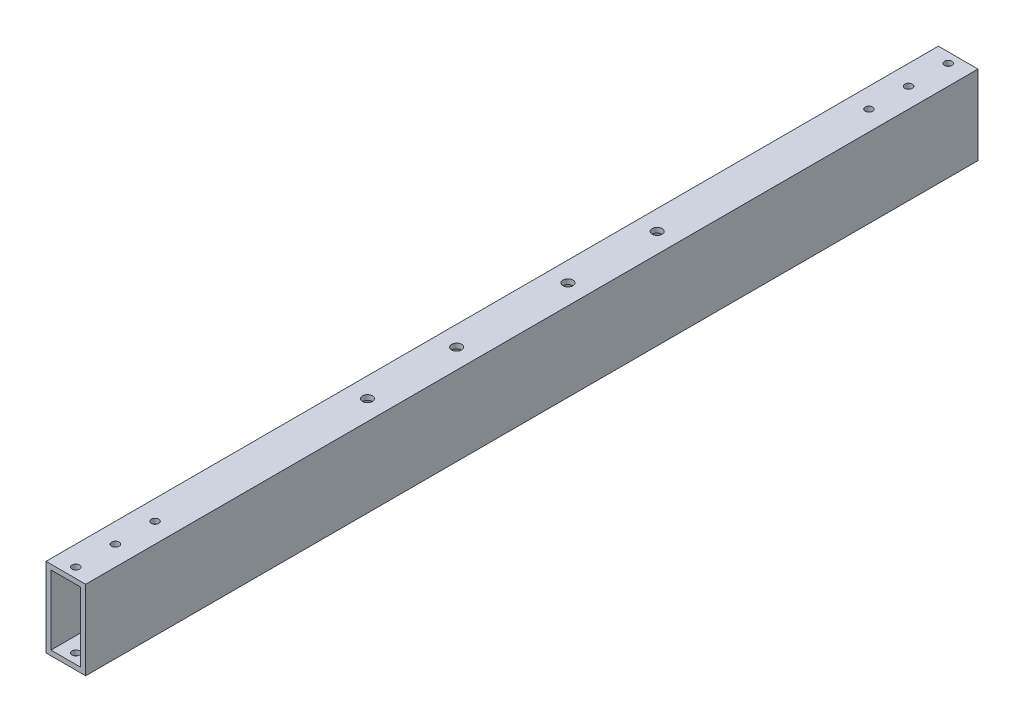
ISO-10303-21;
HEADER;
FILE_DESCRIPTION(('STEP AP214'),'2;1');
FILE_NAME('part.step','',(''),(''),'','','');
FILE_SCHEMA(('AUTOMOTIVE_DESIGN { 1 0 10303 214 1 1 1 1 }'));
ENDSEC;
DATA;
#1=APPLICATION_CONTEXT('core data for automotive mechanical design processes');
#2=APPLICATION_PROTOCOL_DEFINITION('international standard','automotive_design',2000,#1);
#3=PRODUCT_CONTEXT('',#1,'mechanical');
#4=PRODUCT('Part','Part','',(#3));
#5=PRODUCT_RELATED_PRODUCT_CATEGORY('part','',(#4));
#6=PRODUCT_DEFINITION_FORMATION('','',#4);
#7=PRODUCT_DEFINITION_CONTEXT('part definition',#1,'design');
#8=PRODUCT_DEFINITION('design','',#6,#7);
#9=PRODUCT_DEFINITION_SHAPE('','',#8);
#10=(LENGTH_UNIT() NAMED_UNIT(*) SI_UNIT(.MILLI.,.METRE.));
#11=(NAMED_UNIT(*) PLANE_ANGLE_UNIT() SI_UNIT($,.RADIAN.));
#12=(NAMED_UNIT(*) SI_UNIT($,.STERADIAN.) SOLID_ANGLE_UNIT());
#13=UNCERTAINTY_MEASURE_WITH_UNIT(LENGTH_MEASURE(1.E-05),#10,'distance_accuracy_value','');
#14=(GEOMETRIC_REPRESENTATION_CONTEXT(3) GLOBAL_UNCERTAINTY_ASSIGNED_CONTEXT((#13)) GLOBAL_UNIT_ASSIGNED_CONTEXT((#10,
#11,#12)) REPRESENTATION_CONTEXT('',''));
#15=CARTESIAN_POINT('',(0.,0.,0.));
#16=DIRECTION('',(0.,0.,1.));
#17=DIRECTION('',(1.,0.,0.));
#18=AXIS2_PLACEMENT_3D('',#15,#16,#17);
#19=CARTESIAN_POINT('',(0.,0.,571.5));
#20=DIRECTION('',(0.,0.,1.));
#21=DIRECTION('',(1.,0.,0.));
#22=AXIS2_PLACEMENT_3D('',#19,#20,#21);
#23=PLANE('',#22);
#24=DIRECTION('',(0.,1.,0.));
#25=VECTOR('',#24,1.);
#26=CARTESIAN_POINT('',(12.7,-25.4,571.5));
#27=LINE('',#26,#25);
#28=CARTESIAN_POINT('',(12.7,-25.4,571.5));
#29=VERTEX_POINT('',#28);
#30=CARTESIAN_POINT('',(12.7,25.4,571.5));
#31=VERTEX_POINT('',#30);
#32=EDGE_CURVE('E166',#29,#31,#27,.T.);
#33=ORIENTED_EDGE('',*,*,#32,.T.);
#34=DIRECTION('',(-1.,0.,0.));
#35=VECTOR('',#34,1.);
#36=CARTESIAN_POINT('',(-12.7,25.4,571.5));
#37=LINE('',#36,#35);
#38=CARTESIAN_POINT('',(-12.7,25.4,571.5));
#39=VERTEX_POINT('',#38);
#40=EDGE_CURVE('E169',#31,#39,#37,.T.);
#41=ORIENTED_EDGE('',*,*,#40,.T.);
#42=DIRECTION('',(0.,-1.,0.));
#43=VECTOR('',#42,1.);
#44=CARTESIAN_POINT('',(-12.7,-25.4,571.5));
#45=LINE('',#44,#43);
#46=CARTESIAN_POINT('',(-12.7,-25.4,571.5));
#47=VERTEX_POINT('',#46);
#48=EDGE_CURVE('E172',#39,#47,#45,.T.);
#49=ORIENTED_EDGE('',*,*,#48,.T.);
#50=DIRECTION('',(1.,0.,0.));
#51=VECTOR('',#50,1.);
#52=CARTESIAN_POINT('',(-12.7,-25.4,571.5));
#53=LINE('',#52,#51);
#54=EDGE_CURVE('E174',#47,#29,#53,.T.);
#55=ORIENTED_EDGE('',*,*,#54,.T.);
#56=EDGE_LOOP('',(#33,#41,#49,#55));
#57=FACE_BOUND('',#56,.T.);
#58=DIRECTION('',(-1.,0.,0.));
#59=VECTOR('',#58,1.);
#60=CARTESIAN_POINT('',(0.,22.225,571.5));
#61=LINE('',#60,#59);
#62=CARTESIAN_POINT('',(9.525,22.225,571.5));
#63=VERTEX_POINT('',#62);
#64=CARTESIAN_POINT('',(-9.525,22.225,571.5));
#65=VERTEX_POINT('',#64);
#66=EDGE_CURVE('E136',#63,#65,#61,.T.);
#67=ORIENTED_EDGE('',*,*,#66,.F.);
#68=DIRECTION('',(0.,1.,0.));
#69=VECTOR('',#68,1.);
#70=CARTESIAN_POINT('',(9.525,0.,571.5));
#71=LINE('',#70,#69);
#72=CARTESIAN_POINT('',(9.525,-22.225,571.5));
#73=VERTEX_POINT('',#72);
#74=EDGE_CURVE('E128',#73,#63,#71,.T.);
#75=ORIENTED_EDGE('',*,*,#74,.F.);
#76=DIRECTION('',(1.,0.,0.));
#77=VECTOR('',#76,1.);
#78=CARTESIAN_POINT('',(0.,-22.225,571.5));
#79=LINE('',#78,#77);
#80=CARTESIAN_POINT('',(-9.525,-22.225,571.5));
#81=VERTEX_POINT('',#80);
#82=EDGE_CURVE('E150',#81,#73,#79,.T.);
#83=ORIENTED_EDGE('',*,*,#82,.F.);
#84=DIRECTION('',(0.,-1.,0.));
#85=VECTOR('',#84,1.);
#86=CARTESIAN_POINT('',(-9.525,0.,571.5));
#87=LINE('',#86,#85);
#88=EDGE_CURVE('E148',#65,#81,#87,.T.);
#89=ORIENTED_EDGE('',*,*,#88,.F.);
#90=EDGE_LOOP('',(#67,#75,#83,#89));
#91=FACE_BOUND('',#90,.T.);
#92=ADVANCED_FACE('F61',(#57,#91),#23,.T.);
#93=CARTESIAN_POINT('',(0.,0.,0.));
#94=DIRECTION('',(0.,0.,1.));
#95=DIRECTION('',(1.,0.,0.));
#96=AXIS2_PLACEMENT_3D('',#93,#94,#95);
#97=PLANE('',#96);
#98=DIRECTION('',(0.,1.,0.));
#99=VECTOR('',#98,1.);
#100=CARTESIAN_POINT('',(12.7,-25.4,0.));
#101=LINE('',#100,#99);
#102=CARTESIAN_POINT('',(12.7,-25.4,0.));
#103=VERTEX_POINT('',#102);
#104=CARTESIAN_POINT('',(12.7,25.4,0.));
#105=VERTEX_POINT('',#104);
#106=EDGE_CURVE('E144',#103,#105,#101,.T.);
#107=ORIENTED_EDGE('',*,*,#106,.F.);
#108=DIRECTION('',(1.,0.,0.));
#109=VECTOR('',#108,1.);
#110=CARTESIAN_POINT('',(-12.7,-25.4,0.));
#111=LINE('',#110,#109);
#112=CARTESIAN_POINT('',(-12.7,-25.4,0.));
#113=VERTEX_POINT('',#112);
#114=EDGE_CURVE('E170',#113,#103,#111,.T.);
#115=ORIENTED_EDGE('',*,*,#114,.F.);
#116=DIRECTION('',(0.,-1.,0.));
#117=VECTOR('',#116,1.);
#118=CARTESIAN_POINT('',(-12.7,-25.4,0.));
#119=LINE('',#118,#117);
#120=CARTESIAN_POINT('',(-12.7,25.4,0.));
#121=VERTEX_POINT('',#120);
#122=EDGE_CURVE('E181',#121,#113,#119,.T.);
#123=ORIENTED_EDGE('',*,*,#122,.F.);
#124=DIRECTION('',(-1.,0.,0.));
#125=VECTOR('',#124,1.);
#126=CARTESIAN_POINT('',(-12.7,25.4,0.));
#127=LINE('',#126,#125);
#128=EDGE_CURVE('E179',#105,#121,#127,.T.);
#129=ORIENTED_EDGE('',*,*,#128,.F.);
#130=EDGE_LOOP('',(#107,#115,#123,#129));
#131=FACE_BOUND('',#130,.T.);
#132=DIRECTION('',(0.,1.,0.));
#133=VECTOR('',#132,1.);
#134=CARTESIAN_POINT('',(9.525,0.,0.));
#135=LINE('',#134,#133);
#136=CARTESIAN_POINT('',(9.525,-22.225,0.));
#137=VERTEX_POINT('',#136);
#138=CARTESIAN_POINT('',(9.525,22.225,0.));
#139=VERTEX_POINT('',#138);
#140=EDGE_CURVE('E86',#137,#139,#135,.T.);
#141=ORIENTED_EDGE('',*,*,#140,.T.);
#142=DIRECTION('',(-1.,0.,0.));
#143=VECTOR('',#142,1.);
#144=CARTESIAN_POINT('',(0.,22.225,0.));
#145=LINE('',#144,#143);
#146=CARTESIAN_POINT('',(-9.525,22.225,0.));
#147=VERTEX_POINT('',#146);
#148=EDGE_CURVE('E143',#139,#147,#145,.T.);
#149=ORIENTED_EDGE('',*,*,#148,.T.);
#150=DIRECTION('',(0.,-1.,0.));
#151=VECTOR('',#150,1.);
#152=CARTESIAN_POINT('',(-9.525,0.,0.));
#153=LINE('',#152,#151);
#154=CARTESIAN_POINT('',(-9.525,-22.225,0.));
#155=VERTEX_POINT('',#154);
#156=EDGE_CURVE('E158',#147,#155,#153,.T.);
#157=ORIENTED_EDGE('',*,*,#156,.T.);
#158=DIRECTION('',(1.,0.,0.));
#159=VECTOR('',#158,1.);
#160=CARTESIAN_POINT('',(0.,-22.225,0.));
#161=LINE('',#160,#159);
#162=EDGE_CURVE('E137',#155,#137,#161,.T.);
#163=ORIENTED_EDGE('',*,*,#162,.T.);
#164=EDGE_LOOP('',(#141,#149,#157,#163));
#165=FACE_BOUND('',#164,.T.);
#166=ADVANCED_FACE('F365',(#131,#165),#97,.F.);
#167=CARTESIAN_POINT('',(12.7,-25.4,571.5));
#168=DIRECTION('',(-1.,0.,0.));
#169=DIRECTION('',(0.,0.,1.));
#170=AXIS2_PLACEMENT_3D('',#167,#168,#169);
#171=PLANE('',#170);
#172=ORIENTED_EDGE('',*,*,#106,.T.);
#173=DIRECTION('',(0.,0.,-1.));
#174=VECTOR('',#173,1.);
#175=CARTESIAN_POINT('',(12.7,25.4,571.5));
#176=LINE('',#175,#174);
#177=EDGE_CURVE('E12',#31,#105,#176,.T.);
#178=ORIENTED_EDGE('',*,*,#177,.F.);
#179=ORIENTED_EDGE('',*,*,#32,.F.);
#180=DIRECTION('',(0.,0.,-1.));
#181=VECTOR('',#180,1.);
#182=CARTESIAN_POINT('',(12.7,-25.4,571.5));
#183=LINE('',#182,#181);
#184=EDGE_CURVE('E176',#29,#103,#183,.T.);
#185=ORIENTED_EDGE('',*,*,#184,.T.);
#186=EDGE_LOOP('',(#172,#178,#179,#185));
#187=FACE_BOUND('',#186,.T.);
#188=ADVANCED_FACE('F63',(#187),#171,.F.);
#189=CARTESIAN_POINT('',(-12.7,25.4,571.5));
#190=DIRECTION('',(0.,-1.,0.));
#191=DIRECTION('',(0.,0.,-1.));
#192=AXIS2_PLACEMENT_3D('',#189,#190,#191);
#193=PLANE('',#192);
#194=CARTESIAN_POINT('',(0.,25.4,321.183));
#195=DIRECTION('',(0.,1.,0.));
#196=DIRECTION('',(0.,0.,1.));
#197=AXIS2_PLACEMENT_3D('',#194,#195,#196);
#198=CIRCLE('',#197,3.17499999999999);
#199=CARTESIAN_POINT('',(0.,25.4,324.358));
#200=VERTEX_POINT('',#199);
#201=EDGE_CURVE('E243',#200,#200,#198,.T.);
#202=ORIENTED_EDGE('',*,*,#201,.F.);
#203=EDGE_LOOP('',(#202));
#204=FACE_BOUND('',#203,.T.);
#205=CARTESIAN_POINT('',(0.,25.4,378.333));
#206=DIRECTION('',(0.,1.,0.));
#207=DIRECTION('',(0.,0.,1.));
#208=AXIS2_PLACEMENT_3D('',#205,#206,#207);
#209=CIRCLE('',#208,3.17499999999999);
#210=CARTESIAN_POINT('',(0.,25.4,381.508));
#211=VERTEX_POINT('',#210);
#212=EDGE_CURVE('E283',#211,#211,#209,.T.);
#213=ORIENTED_EDGE('',*,*,#212,.F.);
#214=EDGE_LOOP('',(#213));
#215=FACE_BOUND('',#214,.T.);
#216=CARTESIAN_POINT('',(0.,25.4,192.786));
#217=DIRECTION('',(0.,1.,0.));
#218=DIRECTION('',(0.,0.,1.));
#219=AXIS2_PLACEMENT_3D('',#216,#217,#218);
#220=CIRCLE('',#219,3.17499999999999);
#221=CARTESIAN_POINT('',(0.,25.4,195.961));
#222=VERTEX_POINT('',#221);
#223=EDGE_CURVE('E290',#222,#222,#220,.T.);
#224=ORIENTED_EDGE('',*,*,#223,.F.);
#225=EDGE_LOOP('',(#224));
#226=FACE_BOUND('',#225,.T.);
#227=CARTESIAN_POINT('',(0.,25.4,249.936));
#228=DIRECTION('',(0.,1.,0.));
#229=DIRECTION('',(0.,0.,1.));
#230=AXIS2_PLACEMENT_3D('',#227,#228,#229);
#231=CIRCLE('',#230,3.17499999999999);
#232=CARTESIAN_POINT('',(0.,25.4,253.111));
#233=VERTEX_POINT('',#232);
#234=EDGE_CURVE('E297',#233,#233,#231,.T.);
#235=ORIENTED_EDGE('',*,*,#234,.F.);
#236=EDGE_LOOP('',(#235));
#237=FACE_BOUND('',#236,.T.);
#238=CARTESIAN_POINT('',(0.,25.4,6.35));
#239=DIRECTION('',(0.,1.,0.));
#240=DIRECTION('',(0.,0.,1.));
#241=AXIS2_PLACEMENT_3D('',#238,#239,#240);
#242=CIRCLE('',#241,2.38125);
#243=CARTESIAN_POINT('',(0.,25.4,8.73125));
#244=VERTEX_POINT('',#243);
#245=EDGE_CURVE('E304',#244,#244,#242,.T.);
#246=ORIENTED_EDGE('',*,*,#245,.F.);
#247=EDGE_LOOP('',(#246));
#248=FACE_BOUND('',#247,.T.);
#249=CARTESIAN_POINT('',(0.,25.4,31.75));
#250=DIRECTION('',(0.,1.,0.));
#251=DIRECTION('',(0.,0.,1.));
#252=AXIS2_PLACEMENT_3D('',#249,#250,#251);
#253=CIRCLE('',#252,2.38125);
#254=CARTESIAN_POINT('',(0.,25.4,34.13125));
#255=VERTEX_POINT('',#254);
#256=EDGE_CURVE('E311',#255,#255,#253,.T.);
#257=ORIENTED_EDGE('',*,*,#256,.F.);
#258=EDGE_LOOP('',(#257));
#259=FACE_BOUND('',#258,.T.);
#260=CARTESIAN_POINT('',(0.,25.4,57.1499999999999));
#261=DIRECTION('',(0.,1.,0.));
#262=DIRECTION('',(0.,0.,1.));
#263=AXIS2_PLACEMENT_3D('',#260,#261,#262);
#264=CIRCLE('',#263,2.38125);
#265=CARTESIAN_POINT('',(0.,25.4,59.5312499999999));
#266=VERTEX_POINT('',#265);
#267=EDGE_CURVE('E318',#266,#266,#264,.T.);
#268=ORIENTED_EDGE('',*,*,#267,.F.);
#269=EDGE_LOOP('',(#268));
#270=FACE_BOUND('',#269,.T.);
#271=CARTESIAN_POINT('',(0.,25.4,539.75));
#272=DIRECTION('',(0.,1.,0.));
#273=DIRECTION('',(0.,0.,1.));
#274=AXIS2_PLACEMENT_3D('',#271,#272,#273);
#275=CIRCLE('',#274,2.38125);
#276=CARTESIAN_POINT('',(0.,25.4,542.13125));
#277=VERTEX_POINT('',#276);
#278=EDGE_CURVE('E325',#277,#277,#275,.T.);
#279=ORIENTED_EDGE('',*,*,#278,.F.);
#280=EDGE_LOOP('',(#279));
#281=FACE_BOUND('',#280,.T.);
#282=CARTESIAN_POINT('',(0.,25.4,514.35));
#283=DIRECTION('',(0.,1.,0.));
#284=DIRECTION('',(0.,0.,1.));
#285=AXIS2_PLACEMENT_3D('',#282,#283,#284);
#286=CIRCLE('',#285,2.38125);
#287=CARTESIAN_POINT('',(0.,25.4,516.73125));
#288=VERTEX_POINT('',#287);
#289=EDGE_CURVE('E332',#288,#288,#286,.T.);
#290=ORIENTED_EDGE('',*,*,#289,.F.);
#291=EDGE_LOOP('',(#290));
#292=FACE_BOUND('',#291,.T.);
#293=CARTESIAN_POINT('',(0.,25.4,565.15));
#294=DIRECTION('',(0.,1.,0.));
#295=DIRECTION('',(0.,0.,1.));
#296=AXIS2_PLACEMENT_3D('',#293,#294,#295);
#297=CIRCLE('',#296,2.38125);
#298=CARTESIAN_POINT('',(0.,25.4,567.53125));
#299=VERTEX_POINT('',#298);
#300=EDGE_CURVE('E339',#299,#299,#297,.T.);
#301=ORIENTED_EDGE('',*,*,#300,.F.);
#302=EDGE_LOOP('',(#301));
#303=FACE_BOUND('',#302,.T.);
#304=ORIENTED_EDGE('',*,*,#128,.T.);
#305=DIRECTION('',(0.,0.,-1.));
#306=VECTOR('',#305,1.);
#307=CARTESIAN_POINT('',(-12.7,25.4,571.5));
#308=LINE('',#307,#306);
#309=EDGE_CURVE('E70',#39,#121,#308,.T.);
#310=ORIENTED_EDGE('',*,*,#309,.F.);
#311=ORIENTED_EDGE('',*,*,#40,.F.);
#312=ORIENTED_EDGE('',*,*,#177,.T.);
#313=EDGE_LOOP('',(#304,#310,#311,#312));
#314=FACE_BOUND('',#313,.T.);
#315=ADVANCED_FACE('F379',(#204,#215,#226,#237,#248,#259,#270,#281,#292,#303,#314),#193,.F.);
#316=CARTESIAN_POINT('',(-12.7,-25.4,571.5));
#317=DIRECTION('',(1.,0.,0.));
#318=DIRECTION('',(0.,0.,-1.));
#319=AXIS2_PLACEMENT_3D('',#316,#317,#318);
#320=PLANE('',#319);
#321=CARTESIAN_POINT('',(-12.7,17.1450000000001,103.886000000001));
#322=DIRECTION('',(-1.,0.,0.));
#323=DIRECTION('',(0.,0.,1.));
#324=AXIS2_PLACEMENT_3D('',#321,#322,#323);
#325=CIRCLE('',#324,3.17499999999999);
#326=CARTESIAN_POINT('',(-12.7,17.1450000000001,107.061000000001));
#327=VERTEX_POINT('',#326);
#328=EDGE_CURVE('E265',#327,#327,#325,.T.);
#329=ORIENTED_EDGE('',*,*,#328,.F.);
#330=EDGE_LOOP('',(#329));
#331=FACE_BOUND('',#330,.T.);
#332=CARTESIAN_POINT('',(-12.7,1.27000000000006,103.886000000001));
#333=DIRECTION('',(-1.,0.,0.));
#334=DIRECTION('',(0.,0.,1.));
#335=AXIS2_PLACEMENT_3D('',#332,#333,#334);
#336=CIRCLE('',#335,3.17499999999999);
#337=CARTESIAN_POINT('',(-12.7,1.27000000000006,107.061000000001));
#338=VERTEX_POINT('',#337);
#339=EDGE_CURVE('E255',#338,#338,#336,.T.);
#340=ORIENTED_EDGE('',*,*,#339,.F.);
#341=EDGE_LOOP('',(#340));
#342=FACE_BOUND('',#341,.T.);
#343=CARTESIAN_POINT('',(-12.7,8.8900000000012,116.586));
#344=DIRECTION('',(-1.,0.,0.));
#345=DIRECTION('',(0.,0.,1.));
#346=AXIS2_PLACEMENT_3D('',#343,#344,#345);
#347=CIRCLE('',#346,3.17499999999999);
#348=CARTESIAN_POINT('',(-12.7,8.8900000000012,119.761));
#349=VERTEX_POINT('',#348);
#350=EDGE_CURVE('E252',#349,#349,#347,.T.);
#351=ORIENTED_EDGE('',*,*,#350,.F.);
#352=EDGE_LOOP('',(#351));
#353=FACE_BOUND('',#352,.T.);
#354=CARTESIAN_POINT('',(-12.7,8.89000000000114,454.914000000001));
#355=DIRECTION('',(-1.,0.,0.));
#356=DIRECTION('',(0.,0.,1.));
#357=AXIS2_PLACEMENT_3D('',#354,#355,#356);
#358=CIRCLE('',#357,3.17499999999999);
#359=CARTESIAN_POINT('',(-12.7,8.89000000000114,458.089000000001));
#360=VERTEX_POINT('',#359);
#361=EDGE_CURVE('E251',#360,#360,#358,.T.);
#362=ORIENTED_EDGE('',*,*,#361,.F.);
#363=EDGE_LOOP('',(#362));
#364=FACE_BOUND('',#363,.T.);
#365=CARTESIAN_POINT('',(-12.7,1.27000000000115,467.614000000001));
#366=DIRECTION('',(-1.,0.,0.));
#367=DIRECTION('',(0.,0.,1.));
#368=AXIS2_PLACEMENT_3D('',#365,#366,#367);
#369=CIRCLE('',#368,3.17499999999999);
#370=CARTESIAN_POINT('',(-12.7,1.27000000000115,470.789000000001));
#371=VERTEX_POINT('',#370);
#372=EDGE_CURVE('E248',#371,#371,#369,.T.);
#373=ORIENTED_EDGE('',*,*,#372,.F.);
#374=EDGE_LOOP('',(#373));
#375=FACE_BOUND('',#374,.T.);
#376=CARTESIAN_POINT('',(-12.7,17.1450000000012,467.614000000001));
#377=DIRECTION('',(-1.,0.,0.));
#378=DIRECTION('',(0.,0.,1.));
#379=AXIS2_PLACEMENT_3D('',#376,#377,#378);
#380=CIRCLE('',#379,3.17499999999999);
#381=CARTESIAN_POINT('',(-12.7,17.1450000000012,470.789000000001));
#382=VERTEX_POINT('',#381);
#383=EDGE_CURVE('E244',#382,#382,#380,.T.);
#384=ORIENTED_EDGE('',*,*,#383,.F.);
#385=EDGE_LOOP('',(#384));
#386=FACE_BOUND('',#385,.T.);
#387=ORIENTED_EDGE('',*,*,#122,.T.);
#388=DIRECTION('',(0.,0.,-1.));
#389=VECTOR('',#388,1.);
#390=CARTESIAN_POINT('',(-12.7,-25.4,571.5));
#391=LINE('',#390,#389);
#392=EDGE_CURVE('E186',#47,#113,#391,.T.);
#393=ORIENTED_EDGE('',*,*,#392,.F.);
#394=ORIENTED_EDGE('',*,*,#48,.F.);
#395=ORIENTED_EDGE('',*,*,#309,.T.);
#396=EDGE_LOOP('',(#387,#393,#394,#395));
#397=FACE_BOUND('',#396,.T.);
#398=ADVANCED_FACE('F376',(#331,#342,#353,#364,#375,#386,#397),#320,.F.);
#399=CARTESIAN_POINT('',(-12.7,-25.4,571.5));
#400=DIRECTION('',(0.,1.,0.));
#401=DIRECTION('',(0.,0.,1.));
#402=AXIS2_PLACEMENT_3D('',#399,#400,#401);
#403=PLANE('',#402);
#404=CARTESIAN_POINT('',(0.,-25.4,321.183));
#405=DIRECTION('',(0.,1.,0.));
#406=DIRECTION('',(0.,0.,1.));
#407=AXIS2_PLACEMENT_3D('',#404,#405,#406);
#408=CIRCLE('',#407,3.17499999999999);
#409=CARTESIAN_POINT('',(0.,-25.4,324.358));
#410=VERTEX_POINT('',#409);
#411=EDGE_CURVE('E239',#410,#410,#408,.T.);
#412=ORIENTED_EDGE('',*,*,#411,.T.);
#413=EDGE_LOOP('',(#412));
#414=FACE_BOUND('',#413,.T.);
#415=CARTESIAN_POINT('',(0.,-25.4,378.333));
#416=DIRECTION('',(0.,1.,0.));
#417=DIRECTION('',(0.,0.,1.));
#418=AXIS2_PLACEMENT_3D('',#415,#416,#417);
#419=CIRCLE('',#418,3.17499999999999);
#420=CARTESIAN_POINT('',(0.,-25.4,381.508));
#421=VERTEX_POINT('',#420);
#422=EDGE_CURVE('E234',#421,#421,#419,.T.);
#423=ORIENTED_EDGE('',*,*,#422,.T.);
#424=EDGE_LOOP('',(#423));
#425=FACE_BOUND('',#424,.T.);
#426=CARTESIAN_POINT('',(0.,-25.4,192.786));
#427=DIRECTION('',(0.,1.,0.));
#428=DIRECTION('',(0.,0.,1.));
#429=AXIS2_PLACEMENT_3D('',#426,#427,#428);
#430=CIRCLE('',#429,3.17499999999999);
#431=CARTESIAN_POINT('',(0.,-25.4,195.961));
#432=VERTEX_POINT('',#431);
#433=EDGE_CURVE('E229',#432,#432,#430,.T.);
#434=ORIENTED_EDGE('',*,*,#433,.T.);
#435=EDGE_LOOP('',(#434));
#436=FACE_BOUND('',#435,.T.);
#437=CARTESIAN_POINT('',(0.,-25.4,249.936));
#438=DIRECTION('',(0.,1.,0.));
#439=DIRECTION('',(0.,0.,1.));
#440=AXIS2_PLACEMENT_3D('',#437,#438,#439);
#441=CIRCLE('',#440,3.17499999999999);
#442=CARTESIAN_POINT('',(0.,-25.4,253.111));
#443=VERTEX_POINT('',#442);
#444=EDGE_CURVE('E224',#443,#443,#441,.T.);
#445=ORIENTED_EDGE('',*,*,#444,.T.);
#446=EDGE_LOOP('',(#445));
#447=FACE_BOUND('',#446,.T.);
#448=CARTESIAN_POINT('',(0.,-25.4,6.35));
#449=DIRECTION('',(0.,1.,0.));
#450=DIRECTION('',(0.,0.,1.));
#451=AXIS2_PLACEMENT_3D('',#448,#449,#450);
#452=CIRCLE('',#451,2.38124999999999);
#453=CARTESIAN_POINT('',(0.,-25.4,8.73124999999999));
#454=VERTEX_POINT('',#453);
#455=EDGE_CURVE('E219',#454,#454,#452,.T.);
#456=ORIENTED_EDGE('',*,*,#455,.T.);
#457=EDGE_LOOP('',(#456));
#458=FACE_BOUND('',#457,.T.);
#459=CARTESIAN_POINT('',(0.,-25.4,31.75));
#460=DIRECTION('',(0.,1.,0.));
#461=DIRECTION('',(0.,0.,1.));
#462=AXIS2_PLACEMENT_3D('',#459,#460,#461);
#463=CIRCLE('',#462,2.38124999999999);
#464=CARTESIAN_POINT('',(0.,-25.4,34.13125));
#465=VERTEX_POINT('',#464);
#466=EDGE_CURVE('E214',#465,#465,#463,.T.);
#467=ORIENTED_EDGE('',*,*,#466,.T.);
#468=EDGE_LOOP('',(#467));
#469=FACE_BOUND('',#468,.T.);
#470=CARTESIAN_POINT('',(0.,-25.4,57.1499999999999));
#471=DIRECTION('',(0.,1.,0.));
#472=DIRECTION('',(0.,0.,1.));
#473=AXIS2_PLACEMENT_3D('',#470,#471,#472);
#474=CIRCLE('',#473,2.38124999999999);
#475=CARTESIAN_POINT('',(0.,-25.4,59.5312499999999));
#476=VERTEX_POINT('',#475);
#477=EDGE_CURVE('E209',#476,#476,#474,.T.);
#478=ORIENTED_EDGE('',*,*,#477,.T.);
#479=EDGE_LOOP('',(#478));
#480=FACE_BOUND('',#479,.T.);
#481=CARTESIAN_POINT('',(0.,-25.4,539.75));
#482=DIRECTION('',(0.,1.,0.));
#483=DIRECTION('',(0.,0.,1.));
#484=AXIS2_PLACEMENT_3D('',#481,#482,#483);
#485=CIRCLE('',#484,2.38124999999999);
#486=CARTESIAN_POINT('',(0.,-25.4,542.13125));
#487=VERTEX_POINT('',#486);
#488=EDGE_CURVE('E204',#487,#487,#485,.T.);
#489=ORIENTED_EDGE('',*,*,#488,.T.);
#490=EDGE_LOOP('',(#489));
#491=FACE_BOUND('',#490,.T.);
#492=CARTESIAN_POINT('',(0.,-25.4,514.35));
#493=DIRECTION('',(0.,1.,0.));
#494=DIRECTION('',(0.,0.,1.));
#495=AXIS2_PLACEMENT_3D('',#492,#493,#494);
#496=CIRCLE('',#495,2.38124999999999);
#497=CARTESIAN_POINT('',(0.,-25.4,516.73125));
#498=VERTEX_POINT('',#497);
#499=EDGE_CURVE('E199',#498,#498,#496,.T.);
#500=ORIENTED_EDGE('',*,*,#499,.T.);
#501=EDGE_LOOP('',(#500));
#502=FACE_BOUND('',#501,.T.);
#503=CARTESIAN_POINT('',(0.,-25.4,565.15));
#504=DIRECTION('',(0.,1.,0.));
#505=DIRECTION('',(0.,0.,1.));
#506=AXIS2_PLACEMENT_3D('',#503,#504,#505);
#507=CIRCLE('',#506,2.38124999999999);
#508=CARTESIAN_POINT('',(0.,-25.4,567.53125));
#509=VERTEX_POINT('',#508);
#510=EDGE_CURVE('E194',#509,#509,#507,.T.);
#511=ORIENTED_EDGE('',*,*,#510,.T.);
#512=EDGE_LOOP('',(#511));
#513=FACE_BOUND('',#512,.T.);
#514=ORIENTED_EDGE('',*,*,#114,.T.);
#515=ORIENTED_EDGE('',*,*,#184,.F.);
#516=ORIENTED_EDGE('',*,*,#54,.F.);
#517=ORIENTED_EDGE('',*,*,#392,.T.);
#518=EDGE_LOOP('',(#514,#515,#516,#517));
#519=FACE_BOUND('',#518,.T.);
#520=ADVANCED_FACE('F360',(#414,#425,#436,#447,#458,#469,#480,#491,#502,#513,#519),#403,.F.);
#521=CARTESIAN_POINT('',(9.525,0.,571.5));
#522=DIRECTION('',(-1.,0.,0.));
#523=DIRECTION('',(0.,0.,1.));
#524=AXIS2_PLACEMENT_3D('',#521,#522,#523);
#525=PLANE('',#524);
#526=ORIENTED_EDGE('',*,*,#140,.F.);
#527=DIRECTION('',(0.,0.,-1.));
#528=VECTOR('',#527,1.);
#529=CARTESIAN_POINT('',(9.525,-22.225,571.5));
#530=LINE('',#529,#528);
#531=EDGE_CURVE('E132',#73,#137,#530,.T.);
#532=ORIENTED_EDGE('',*,*,#531,.F.);
#533=ORIENTED_EDGE('',*,*,#74,.T.);
#534=DIRECTION('',(0.,0.,-1.));
#535=VECTOR('',#534,1.);
#536=CARTESIAN_POINT('',(9.525,22.225,571.5));
#537=LINE('',#536,#535);
#538=EDGE_CURVE('E131',#63,#139,#537,.T.);
#539=ORIENTED_EDGE('',*,*,#538,.T.);
#540=EDGE_LOOP('',(#526,#532,#533,#539));
#541=FACE_BOUND('',#540,.T.);
#542=ADVANCED_FACE('F130',(#541),#525,.T.);
#543=CARTESIAN_POINT('',(0.,22.225,571.5));
#544=DIRECTION('',(0.,-1.,0.));
#545=DIRECTION('',(0.,0.,-1.));
#546=AXIS2_PLACEMENT_3D('',#543,#544,#545);
#547=PLANE('',#546);
#548=CARTESIAN_POINT('',(0.,22.225,321.183));
#549=DIRECTION('',(0.,-1.,0.));
#550=DIRECTION('',(0.,0.,-1.));
#551=AXIS2_PLACEMENT_3D('',#548,#549,#550);
#552=CIRCLE('',#551,3.17499999999999);
#553=CARTESIAN_POINT('',(0.,22.225,318.008));
#554=VERTEX_POINT('',#553);
#555=EDGE_CURVE('E238',#554,#554,#552,.T.);
#556=ORIENTED_EDGE('',*,*,#555,.F.);
#557=EDGE_LOOP('',(#556));
#558=FACE_BOUND('',#557,.T.);
#559=CARTESIAN_POINT('',(0.,22.225,378.333));
#560=DIRECTION('',(0.,-1.,0.));
#561=DIRECTION('',(0.,0.,-1.));
#562=AXIS2_PLACEMENT_3D('',#559,#560,#561);
#563=CIRCLE('',#562,3.17499999999999);
#564=CARTESIAN_POINT('',(0.,22.225,375.158));
#565=VERTEX_POINT('',#564);
#566=EDGE_CURVE('E233',#565,#565,#563,.T.);
#567=ORIENTED_EDGE('',*,*,#566,.F.);
#568=EDGE_LOOP('',(#567));
#569=FACE_BOUND('',#568,.T.);
#570=CARTESIAN_POINT('',(0.,22.225,192.786));
#571=DIRECTION('',(0.,-1.,0.));
#572=DIRECTION('',(0.,0.,-1.));
#573=AXIS2_PLACEMENT_3D('',#570,#571,#572);
#574=CIRCLE('',#573,3.17499999999999);
#575=CARTESIAN_POINT('',(0.,22.225,189.611));
#576=VERTEX_POINT('',#575);
#577=EDGE_CURVE('E228',#576,#576,#574,.T.);
#578=ORIENTED_EDGE('',*,*,#577,.F.);
#579=EDGE_LOOP('',(#578));
#580=FACE_BOUND('',#579,.T.);
#581=CARTESIAN_POINT('',(0.,22.225,249.936));
#582=DIRECTION('',(0.,-1.,0.));
#583=DIRECTION('',(0.,0.,-1.));
#584=AXIS2_PLACEMENT_3D('',#581,#582,#583);
#585=CIRCLE('',#584,3.17499999999999);
#586=CARTESIAN_POINT('',(0.,22.225,246.761));
#587=VERTEX_POINT('',#586);
#588=EDGE_CURVE('E223',#587,#587,#585,.T.);
#589=ORIENTED_EDGE('',*,*,#588,.F.);
#590=EDGE_LOOP('',(#589));
#591=FACE_BOUND('',#590,.T.);
#592=CARTESIAN_POINT('',(0.,22.225,6.35));
#593=DIRECTION('',(0.,-1.,0.));
#594=DIRECTION('',(0.,0.,-1.));
#595=AXIS2_PLACEMENT_3D('',#592,#593,#594);
#596=CIRCLE('',#595,2.38125);
#597=CARTESIAN_POINT('',(0.,22.225,3.96875));
#598=VERTEX_POINT('',#597);
#599=EDGE_CURVE('E218',#598,#598,#596,.T.);
#600=ORIENTED_EDGE('',*,*,#599,.F.);
#601=EDGE_LOOP('',(#600));
#602=FACE_BOUND('',#601,.T.);
#603=CARTESIAN_POINT('',(0.,22.225,31.75));
#604=DIRECTION('',(0.,-1.,0.));
#605=DIRECTION('',(0.,0.,-1.));
#606=AXIS2_PLACEMENT_3D('',#603,#604,#605);
#607=CIRCLE('',#606,2.38125);
#608=CARTESIAN_POINT('',(0.,22.225,29.36875));
#609=VERTEX_POINT('',#608);
#610=EDGE_CURVE('E210',#609,#609,#607,.T.);
#611=ORIENTED_EDGE('',*,*,#610,.F.);
#612=EDGE_LOOP('',(#611));
#613=FACE_BOUND('',#612,.T.);
#614=CARTESIAN_POINT('',(0.,22.225,57.1499999999999));
#615=DIRECTION('',(0.,-1.,0.));
#616=DIRECTION('',(0.,0.,-1.));
#617=AXIS2_PLACEMENT_3D('',#614,#615,#616);
#618=CIRCLE('',#617,2.38125);
#619=CARTESIAN_POINT('',(0.,22.225,54.7687499999999));
#620=VERTEX_POINT('',#619);
#621=EDGE_CURVE('E208',#620,#620,#618,.T.);
#622=ORIENTED_EDGE('',*,*,#621,.F.);
#623=EDGE_LOOP('',(#622));
#624=FACE_BOUND('',#623,.T.);
#625=CARTESIAN_POINT('',(0.,22.225,539.75));
#626=DIRECTION('',(0.,-1.,0.));
#627=DIRECTION('',(0.,0.,-1.));
#628=AXIS2_PLACEMENT_3D('',#625,#626,#627);
#629=CIRCLE('',#628,2.38125);
#630=CARTESIAN_POINT('',(0.,22.225,537.36875));
#631=VERTEX_POINT('',#630);
#632=EDGE_CURVE('E203',#631,#631,#629,.T.);
#633=ORIENTED_EDGE('',*,*,#632,.F.);
#634=EDGE_LOOP('',(#633));
#635=FACE_BOUND('',#634,.T.);
#636=CARTESIAN_POINT('',(0.,22.225,514.35));
#637=DIRECTION('',(0.,-1.,0.));
#638=DIRECTION('',(0.,0.,-1.));
#639=AXIS2_PLACEMENT_3D('',#636,#637,#638);
#640=CIRCLE('',#639,2.38125);
#641=CARTESIAN_POINT('',(0.,22.225,511.96875));
#642=VERTEX_POINT('',#641);
#643=EDGE_CURVE('E195',#642,#642,#640,.T.);
#644=ORIENTED_EDGE('',*,*,#643,.F.);
#645=EDGE_LOOP('',(#644));
#646=FACE_BOUND('',#645,.T.);
#647=CARTESIAN_POINT('',(0.,22.225,565.15));
#648=DIRECTION('',(0.,-1.,0.));
#649=DIRECTION('',(0.,0.,-1.));
#650=AXIS2_PLACEMENT_3D('',#647,#648,#649);
#651=CIRCLE('',#650,2.38125);
#652=CARTESIAN_POINT('',(0.,22.225,562.76875));
#653=VERTEX_POINT('',#652);
#654=EDGE_CURVE('E156',#653,#653,#651,.T.);
#655=ORIENTED_EDGE('',*,*,#654,.F.);
#656=EDGE_LOOP('',(#655));
#657=FACE_BOUND('',#656,.T.);
#658=ORIENTED_EDGE('',*,*,#148,.F.);
#659=ORIENTED_EDGE('',*,*,#538,.F.);
#660=ORIENTED_EDGE('',*,*,#66,.T.);
#661=DIRECTION('',(0.,0.,-1.));
#662=VECTOR('',#661,1.);
#663=CARTESIAN_POINT('',(-9.525,22.225,571.5));
#664=LINE('',#663,#662);
#665=EDGE_CURVE('E145',#65,#147,#664,.T.);
#666=ORIENTED_EDGE('',*,*,#665,.T.);
#667=EDGE_LOOP('',(#658,#659,#660,#666));
#668=FACE_BOUND('',#667,.T.);
#669=ADVANCED_FACE('F140',(#558,#569,#580,#591,#602,#613,#624,#635,#646,#657,#668),#547,.T.);
#670=CARTESIAN_POINT('',(-9.525,0.,571.5));
#671=DIRECTION('',(1.,0.,0.));
#672=DIRECTION('',(0.,0.,-1.));
#673=AXIS2_PLACEMENT_3D('',#670,#671,#672);
#674=PLANE('',#673);
#675=CARTESIAN_POINT('',(-9.525,17.1450000000001,103.886000000001));
#676=DIRECTION('',(1.,0.,0.));
#677=DIRECTION('',(0.,0.,-1.));
#678=AXIS2_PLACEMENT_3D('',#675,#676,#677);
#679=CIRCLE('',#678,3.17499999999999);
#680=CARTESIAN_POINT('',(-9.525,17.1450000000001,100.711000000001));
#681=VERTEX_POINT('',#680);
#682=EDGE_CURVE('E65',#681,#681,#679,.T.);
#683=ORIENTED_EDGE('',*,*,#682,.F.);
#684=EDGE_LOOP('',(#683));
#685=FACE_BOUND('',#684,.T.);
#686=CARTESIAN_POINT('',(-9.525,1.27000000000006,103.886000000001));
#687=DIRECTION('',(1.,0.,0.));
#688=DIRECTION('',(0.,0.,-1.));
#689=AXIS2_PLACEMENT_3D('',#686,#687,#688);
#690=CIRCLE('',#689,3.17499999999999);
#691=CARTESIAN_POINT('',(-9.525,1.27000000000006,100.711000000001));
#692=VERTEX_POINT('',#691);
#693=EDGE_CURVE('E253',#692,#692,#690,.T.);
#694=ORIENTED_EDGE('',*,*,#693,.F.);
#695=EDGE_LOOP('',(#694));
#696=FACE_BOUND('',#695,.T.);
#697=CARTESIAN_POINT('',(-9.525,8.8900000000012,116.586));
#698=DIRECTION('',(1.,0.,0.));
#699=DIRECTION('',(0.,0.,-1.));
#700=AXIS2_PLACEMENT_3D('',#697,#698,#699);
#701=CIRCLE('',#700,3.17499999999999);
#702=CARTESIAN_POINT('',(-9.525,8.8900000000012,113.411));
#703=VERTEX_POINT('',#702);
#704=EDGE_CURVE('E249',#703,#703,#701,.T.);
#705=ORIENTED_EDGE('',*,*,#704,.F.);
#706=EDGE_LOOP('',(#705));
#707=FACE_BOUND('',#706,.T.);
#708=CARTESIAN_POINT('',(-9.525,8.89000000000114,454.914000000001));
#709=DIRECTION('',(1.,0.,0.));
#710=DIRECTION('',(0.,0.,-1.));
#711=AXIS2_PLACEMENT_3D('',#708,#709,#710);
#712=CIRCLE('',#711,3.17499999999999);
#713=CARTESIAN_POINT('',(-9.525,8.89000000000114,451.739000000001));
#714=VERTEX_POINT('',#713);
#715=EDGE_CURVE('E270',#714,#714,#712,.T.);
#716=ORIENTED_EDGE('',*,*,#715,.F.);
#717=EDGE_LOOP('',(#716));
#718=FACE_BOUND('',#717,.T.);
#719=CARTESIAN_POINT('',(-9.525,1.27000000000115,467.614000000001));
#720=DIRECTION('',(1.,0.,0.));
#721=DIRECTION('',(0.,0.,-1.));
#722=AXIS2_PLACEMENT_3D('',#719,#720,#721);
#723=CIRCLE('',#722,3.17499999999999);
#724=CARTESIAN_POINT('',(-9.525,1.27000000000115,464.439000000001));
#725=VERTEX_POINT('',#724);
#726=EDGE_CURVE('E245',#725,#725,#723,.T.);
#727=ORIENTED_EDGE('',*,*,#726,.F.);
#728=EDGE_LOOP('',(#727));
#729=FACE_BOUND('',#728,.T.);
#730=CARTESIAN_POINT('',(-9.525,17.1450000000012,467.614000000001));
#731=DIRECTION('',(1.,0.,0.));
#732=DIRECTION('',(0.,0.,-1.));
#733=AXIS2_PLACEMENT_3D('',#730,#731,#732);
#734=CIRCLE('',#733,3.17499999999999);
#735=CARTESIAN_POINT('',(-9.525,17.1450000000012,464.439000000001));
#736=VERTEX_POINT('',#735);
#737=EDGE_CURVE('E240',#736,#736,#734,.T.);
#738=ORIENTED_EDGE('',*,*,#737,.F.);
#739=EDGE_LOOP('',(#738));
#740=FACE_BOUND('',#739,.T.);
#741=ORIENTED_EDGE('',*,*,#156,.F.);
#742=ORIENTED_EDGE('',*,*,#665,.F.);
#743=ORIENTED_EDGE('',*,*,#88,.T.);
#744=DIRECTION('',(0.,0.,-1.));
#745=VECTOR('',#744,1.);
#746=CARTESIAN_POINT('',(-9.525,-22.225,571.5));
#747=LINE('',#746,#745);
#748=EDGE_CURVE('E78',#81,#155,#747,.T.);
#749=ORIENTED_EDGE('',*,*,#748,.T.);
#750=EDGE_LOOP('',(#741,#742,#743,#749));
#751=FACE_BOUND('',#750,.T.);
#752=ADVANCED_FACE('F350',(#685,#696,#707,#718,#729,#740,#751),#674,.T.);
#753=CARTESIAN_POINT('',(0.,-22.225,571.5));
#754=DIRECTION('',(0.,1.,0.));
#755=DIRECTION('',(0.,0.,1.));
#756=AXIS2_PLACEMENT_3D('',#753,#754,#755);
#757=PLANE('',#756);
#758=CARTESIAN_POINT('',(0.,-22.225,321.183));
#759=DIRECTION('',(0.,1.,0.));
#760=DIRECTION('',(0.,0.,1.));
#761=AXIS2_PLACEMENT_3D('',#758,#759,#760);
#762=CIRCLE('',#761,3.17499999999999);
#763=CARTESIAN_POINT('',(0.,-22.225,324.358));
#764=VERTEX_POINT('',#763);
#765=EDGE_CURVE('E235',#764,#764,#762,.T.);
#766=ORIENTED_EDGE('',*,*,#765,.F.);
#767=EDGE_LOOP('',(#766));
#768=FACE_BOUND('',#767,.T.);
#769=CARTESIAN_POINT('',(0.,-22.225,378.333));
#770=DIRECTION('',(0.,1.,0.));
#771=DIRECTION('',(0.,0.,1.));
#772=AXIS2_PLACEMENT_3D('',#769,#770,#771);
#773=CIRCLE('',#772,3.17499999999999);
#774=CARTESIAN_POINT('',(0.,-22.225,381.508));
#775=VERTEX_POINT('',#774);
#776=EDGE_CURVE('E230',#775,#775,#773,.T.);
#777=ORIENTED_EDGE('',*,*,#776,.F.);
#778=EDGE_LOOP('',(#777));
#779=FACE_BOUND('',#778,.T.);
#780=CARTESIAN_POINT('',(0.,-22.225,192.786));
#781=DIRECTION('',(0.,1.,0.));
#782=DIRECTION('',(0.,0.,1.));
#783=AXIS2_PLACEMENT_3D('',#780,#781,#782);
#784=CIRCLE('',#783,3.17499999999999);
#785=CARTESIAN_POINT('',(0.,-22.225,195.961));
#786=VERTEX_POINT('',#785);
#787=EDGE_CURVE('E225',#786,#786,#784,.T.);
#788=ORIENTED_EDGE('',*,*,#787,.F.);
#789=EDGE_LOOP('',(#788));
#790=FACE_BOUND('',#789,.T.);
#791=CARTESIAN_POINT('',(0.,-22.225,249.936));
#792=DIRECTION('',(0.,1.,0.));
#793=DIRECTION('',(0.,0.,1.));
#794=AXIS2_PLACEMENT_3D('',#791,#792,#793);
#795=CIRCLE('',#794,3.17499999999999);
#796=CARTESIAN_POINT('',(0.,-22.225,253.111));
#797=VERTEX_POINT('',#796);
#798=EDGE_CURVE('E220',#797,#797,#795,.T.);
#799=ORIENTED_EDGE('',*,*,#798,.F.);
#800=EDGE_LOOP('',(#799));
#801=FACE_BOUND('',#800,.T.);
#802=CARTESIAN_POINT('',(0.,-22.225,6.35));
#803=DIRECTION('',(0.,1.,0.));
#804=DIRECTION('',(0.,0.,1.));
#805=AXIS2_PLACEMENT_3D('',#802,#803,#804);
#806=CIRCLE('',#805,2.38125);
#807=CARTESIAN_POINT('',(0.,-22.225,8.73125));
#808=VERTEX_POINT('',#807);
#809=EDGE_CURVE('E215',#808,#808,#806,.T.);
#810=ORIENTED_EDGE('',*,*,#809,.F.);
#811=EDGE_LOOP('',(#810));
#812=FACE_BOUND('',#811,.T.);
#813=CARTESIAN_POINT('',(0.,-22.225,31.75));
#814=DIRECTION('',(0.,1.,0.));
#815=DIRECTION('',(0.,0.,1.));
#816=AXIS2_PLACEMENT_3D('',#813,#814,#815);
#817=CIRCLE('',#816,2.38125);
#818=CARTESIAN_POINT('',(0.,-22.225,34.13125));
#819=VERTEX_POINT('',#818);
#820=EDGE_CURVE('E213',#819,#819,#817,.T.);
#821=ORIENTED_EDGE('',*,*,#820,.F.);
#822=EDGE_LOOP('',(#821));
#823=FACE_BOUND('',#822,.T.);
#824=CARTESIAN_POINT('',(0.,-22.225,57.1499999999999));
#825=DIRECTION('',(0.,1.,0.));
#826=DIRECTION('',(0.,0.,1.));
#827=AXIS2_PLACEMENT_3D('',#824,#825,#826);
#828=CIRCLE('',#827,2.38125);
#829=CARTESIAN_POINT('',(0.,-22.225,59.5312499999999));
#830=VERTEX_POINT('',#829);
#831=EDGE_CURVE('E205',#830,#830,#828,.T.);
#832=ORIENTED_EDGE('',*,*,#831,.F.);
#833=EDGE_LOOP('',(#832));
#834=FACE_BOUND('',#833,.T.);
#835=CARTESIAN_POINT('',(0.,-22.225,539.75));
#836=DIRECTION('',(0.,1.,0.));
#837=DIRECTION('',(0.,0.,1.));
#838=AXIS2_PLACEMENT_3D('',#835,#836,#837);
#839=CIRCLE('',#838,2.38125);
#840=CARTESIAN_POINT('',(0.,-22.225,542.13125));
#841=VERTEX_POINT('',#840);
#842=EDGE_CURVE('E200',#841,#841,#839,.T.);
#843=ORIENTED_EDGE('',*,*,#842,.F.);
#844=EDGE_LOOP('',(#843));
#845=FACE_BOUND('',#844,.T.);
#846=CARTESIAN_POINT('',(0.,-22.225,514.35));
#847=DIRECTION('',(0.,1.,0.));
#848=DIRECTION('',(0.,0.,1.));
#849=AXIS2_PLACEMENT_3D('',#846,#847,#848);
#850=CIRCLE('',#849,2.38125);
#851=CARTESIAN_POINT('',(0.,-22.225,516.73125));
#852=VERTEX_POINT('',#851);
#853=EDGE_CURVE('E198',#852,#852,#850,.T.);
#854=ORIENTED_EDGE('',*,*,#853,.F.);
#855=EDGE_LOOP('',(#854));
#856=FACE_BOUND('',#855,.T.);
#857=CARTESIAN_POINT('',(0.,-22.225,565.15));
#858=DIRECTION('',(0.,1.,0.));
#859=DIRECTION('',(0.,0.,1.));
#860=AXIS2_PLACEMENT_3D('',#857,#858,#859);
#861=CIRCLE('',#860,2.38125);
#862=CARTESIAN_POINT('',(0.,-22.225,567.53125));
#863=VERTEX_POINT('',#862);
#864=EDGE_CURVE('E191',#863,#863,#861,.T.);
#865=ORIENTED_EDGE('',*,*,#864,.F.);
#866=EDGE_LOOP('',(#865));
#867=FACE_BOUND('',#866,.T.);
#868=ORIENTED_EDGE('',*,*,#162,.F.);
#869=ORIENTED_EDGE('',*,*,#748,.F.);
#870=ORIENTED_EDGE('',*,*,#82,.T.);
#871=ORIENTED_EDGE('',*,*,#531,.T.);
#872=EDGE_LOOP('',(#868,#869,#870,#871));
#873=FACE_BOUND('',#872,.T.);
#874=ADVANCED_FACE('F357',(#768,#779,#790,#801,#812,#823,#834,#845,#856,#867,#873),#757,.T.);
#875=CARTESIAN_POINT('',(0.,25.4,565.15));
#876=DIRECTION('',(0.,1.,0.));
#877=DIRECTION('',(0.,0.,1.));
#878=AXIS2_PLACEMENT_3D('',#875,#876,#877);
#879=CYLINDRICAL_SURFACE('',#878,2.38125);
#880=ORIENTED_EDGE('',*,*,#864,.T.);
#881=EDGE_LOOP('',(#880));
#882=FACE_BOUND('',#881,.T.);
#883=ORIENTED_EDGE('',*,*,#510,.F.);
#884=EDGE_LOOP('',(#883));
#885=FACE_BOUND('',#884,.T.);
#886=ADVANCED_FACE('F422',(#882,#885),#879,.F.);
#887=ORIENTED_EDGE('',*,*,#654,.T.);
#888=EDGE_LOOP('',(#887));
#889=FACE_BOUND('',#888,.T.);
#890=ORIENTED_EDGE('',*,*,#300,.T.);
#891=EDGE_LOOP('',(#890));
#892=FACE_BOUND('',#891,.T.);
#893=ADVANCED_FACE('F346',(#889,#892),#879,.F.);
#894=CARTESIAN_POINT('',(0.,25.4,514.35));
#895=DIRECTION('',(0.,1.,0.));
#896=DIRECTION('',(0.,0.,1.));
#897=AXIS2_PLACEMENT_3D('',#894,#895,#896);
#898=CYLINDRICAL_SURFACE('',#897,2.38125);
#899=ORIENTED_EDGE('',*,*,#643,.T.);
#900=EDGE_LOOP('',(#899));
#901=FACE_BOUND('',#900,.T.);
#902=ORIENTED_EDGE('',*,*,#289,.T.);
#903=EDGE_LOOP('',(#902));
#904=FACE_BOUND('',#903,.T.);
#905=ADVANCED_FACE('F433',(#901,#904),#898,.F.);
#906=ORIENTED_EDGE('',*,*,#853,.T.);
#907=EDGE_LOOP('',(#906));
#908=FACE_BOUND('',#907,.T.);
#909=ORIENTED_EDGE('',*,*,#499,.F.);
#910=EDGE_LOOP('',(#909));
#911=FACE_BOUND('',#910,.T.);
#912=ADVANCED_FACE('F436',(#908,#911),#898,.F.);
#913=CARTESIAN_POINT('',(0.,25.4,539.75));
#914=DIRECTION('',(0.,1.,0.));
#915=DIRECTION('',(0.,0.,1.));
#916=AXIS2_PLACEMENT_3D('',#913,#914,#915);
#917=CYLINDRICAL_SURFACE('',#916,2.38125);
#918=ORIENTED_EDGE('',*,*,#842,.T.);
#919=EDGE_LOOP('',(#918));
#920=FACE_BOUND('',#919,.T.);
#921=ORIENTED_EDGE('',*,*,#488,.F.);
#922=EDGE_LOOP('',(#921));
#923=FACE_BOUND('',#922,.T.);
#924=ADVANCED_FACE('F438',(#920,#923),#917,.F.);
#925=ORIENTED_EDGE('',*,*,#632,.T.);
#926=EDGE_LOOP('',(#925));
#927=FACE_BOUND('',#926,.T.);
#928=ORIENTED_EDGE('',*,*,#278,.T.);
#929=EDGE_LOOP('',(#928));
#930=FACE_BOUND('',#929,.T.);
#931=ADVANCED_FACE('F441',(#927,#930),#917,.F.);
#932=CARTESIAN_POINT('',(0.,25.4,57.1499999999999));
#933=DIRECTION('',(0.,1.,0.));
#934=DIRECTION('',(0.,0.,1.));
#935=AXIS2_PLACEMENT_3D('',#932,#933,#934);
#936=CYLINDRICAL_SURFACE('',#935,2.38125);
#937=ORIENTED_EDGE('',*,*,#831,.T.);
#938=EDGE_LOOP('',(#937));
#939=FACE_BOUND('',#938,.T.);
#940=ORIENTED_EDGE('',*,*,#477,.F.);
#941=EDGE_LOOP('',(#940));
#942=FACE_BOUND('',#941,.T.);
#943=ADVANCED_FACE('F443',(#939,#942),#936,.F.);
#944=ORIENTED_EDGE('',*,*,#621,.T.);
#945=EDGE_LOOP('',(#944));
#946=FACE_BOUND('',#945,.T.);
#947=ORIENTED_EDGE('',*,*,#267,.T.);
#948=EDGE_LOOP('',(#947));
#949=FACE_BOUND('',#948,.T.);
#950=ADVANCED_FACE('F446',(#946,#949),#936,.F.);
#951=CARTESIAN_POINT('',(0.,25.4,31.75));
#952=DIRECTION('',(0.,1.,0.));
#953=DIRECTION('',(0.,0.,1.));
#954=AXIS2_PLACEMENT_3D('',#951,#952,#953);
#955=CYLINDRICAL_SURFACE('',#954,2.38125);
#956=ORIENTED_EDGE('',*,*,#610,.T.);
#957=EDGE_LOOP('',(#956));
#958=FACE_BOUND('',#957,.T.);
#959=ORIENTED_EDGE('',*,*,#256,.T.);
#960=EDGE_LOOP('',(#959));
#961=FACE_BOUND('',#960,.T.);
#962=ADVANCED_FACE('F448',(#958,#961),#955,.F.);
#963=ORIENTED_EDGE('',*,*,#820,.T.);
#964=EDGE_LOOP('',(#963));
#965=FACE_BOUND('',#964,.T.);
#966=ORIENTED_EDGE('',*,*,#466,.F.);
#967=EDGE_LOOP('',(#966));
#968=FACE_BOUND('',#967,.T.);
#969=ADVANCED_FACE('F451',(#965,#968),#955,.F.);
#970=CARTESIAN_POINT('',(0.,25.4,6.35));
#971=DIRECTION('',(0.,1.,0.));
#972=DIRECTION('',(0.,0.,1.));
#973=AXIS2_PLACEMENT_3D('',#970,#971,#972);
#974=CYLINDRICAL_SURFACE('',#973,2.38125);
#975=ORIENTED_EDGE('',*,*,#809,.T.);
#976=EDGE_LOOP('',(#975));
#977=FACE_BOUND('',#976,.T.);
#978=ORIENTED_EDGE('',*,*,#455,.F.);
#979=EDGE_LOOP('',(#978));
#980=FACE_BOUND('',#979,.T.);
#981=ADVANCED_FACE('F453',(#977,#980),#974,.F.);
#982=ORIENTED_EDGE('',*,*,#599,.T.);
#983=EDGE_LOOP('',(#982));
#984=FACE_BOUND('',#983,.T.);
#985=ORIENTED_EDGE('',*,*,#245,.T.);
#986=EDGE_LOOP('',(#985));
#987=FACE_BOUND('',#986,.T.);
#988=ADVANCED_FACE('F456',(#984,#987),#974,.F.);
#989=CARTESIAN_POINT('',(0.,25.4,249.936));
#990=DIRECTION('',(0.,1.,0.));
#991=DIRECTION('',(0.,0.,1.));
#992=AXIS2_PLACEMENT_3D('',#989,#990,#991);
#993=CYLINDRICAL_SURFACE('',#992,3.17499999999999);
#994=ORIENTED_EDGE('',*,*,#798,.T.);
#995=EDGE_LOOP('',(#994));
#996=FACE_BOUND('',#995,.T.);
#997=ORIENTED_EDGE('',*,*,#444,.F.);
#998=EDGE_LOOP('',(#997));
#999=FACE_BOUND('',#998,.T.);
#1000=ADVANCED_FACE('F458',(#996,#999),#993,.F.);
#1001=ORIENTED_EDGE('',*,*,#588,.T.);
#1002=EDGE_LOOP('',(#1001));
#1003=FACE_BOUND('',#1002,.T.);
#1004=ORIENTED_EDGE('',*,*,#234,.T.);
#1005=EDGE_LOOP('',(#1004));
#1006=FACE_BOUND('',#1005,.T.);
#1007=ADVANCED_FACE('F461',(#1003,#1006),#993,.F.);
#1008=CARTESIAN_POINT('',(0.,25.4,192.786));
#1009=DIRECTION('',(0.,1.,0.));
#1010=DIRECTION('',(0.,0.,1.));
#1011=AXIS2_PLACEMENT_3D('',#1008,#1009,#1010);
#1012=CYLINDRICAL_SURFACE('',#1011,3.17499999999999);
#1013=ORIENTED_EDGE('',*,*,#787,.T.);
#1014=EDGE_LOOP('',(#1013));
#1015=FACE_BOUND('',#1014,.T.);
#1016=ORIENTED_EDGE('',*,*,#433,.F.);
#1017=EDGE_LOOP('',(#1016));
#1018=FACE_BOUND('',#1017,.T.);
#1019=ADVANCED_FACE('F463',(#1015,#1018),#1012,.F.);
#1020=ORIENTED_EDGE('',*,*,#577,.T.);
#1021=EDGE_LOOP('',(#1020));
#1022=FACE_BOUND('',#1021,.T.);
#1023=ORIENTED_EDGE('',*,*,#223,.T.);
#1024=EDGE_LOOP('',(#1023));
#1025=FACE_BOUND('',#1024,.T.);
#1026=ADVANCED_FACE('F466',(#1022,#1025),#1012,.F.);
#1027=CARTESIAN_POINT('',(0.,25.4,378.333));
#1028=DIRECTION('',(0.,1.,0.));
#1029=DIRECTION('',(0.,0.,1.));
#1030=AXIS2_PLACEMENT_3D('',#1027,#1028,#1029);
#1031=CYLINDRICAL_SURFACE('',#1030,3.17499999999999);
#1032=ORIENTED_EDGE('',*,*,#776,.T.);
#1033=EDGE_LOOP('',(#1032));
#1034=FACE_BOUND('',#1033,.T.);
#1035=ORIENTED_EDGE('',*,*,#422,.F.);
#1036=EDGE_LOOP('',(#1035));
#1037=FACE_BOUND('',#1036,.T.);
#1038=ADVANCED_FACE('F468',(#1034,#1037),#1031,.F.);
#1039=ORIENTED_EDGE('',*,*,#566,.T.);
#1040=EDGE_LOOP('',(#1039));
#1041=FACE_BOUND('',#1040,.T.);
#1042=ORIENTED_EDGE('',*,*,#212,.T.);
#1043=EDGE_LOOP('',(#1042));
#1044=FACE_BOUND('',#1043,.T.);
#1045=ADVANCED_FACE('F471',(#1041,#1044),#1031,.F.);
#1046=CARTESIAN_POINT('',(0.,25.4,321.183));
#1047=DIRECTION('',(0.,1.,0.));
#1048=DIRECTION('',(0.,0.,1.));
#1049=AXIS2_PLACEMENT_3D('',#1046,#1047,#1048);
#1050=CYLINDRICAL_SURFACE('',#1049,3.17499999999999);
#1051=ORIENTED_EDGE('',*,*,#765,.T.);
#1052=EDGE_LOOP('',(#1051));
#1053=FACE_BOUND('',#1052,.T.);
#1054=ORIENTED_EDGE('',*,*,#411,.F.);
#1055=EDGE_LOOP('',(#1054));
#1056=FACE_BOUND('',#1055,.T.);
#1057=ADVANCED_FACE('F473',(#1053,#1056),#1050,.F.);
#1058=ORIENTED_EDGE('',*,*,#555,.T.);
#1059=EDGE_LOOP('',(#1058));
#1060=FACE_BOUND('',#1059,.T.);
#1061=ORIENTED_EDGE('',*,*,#201,.T.);
#1062=EDGE_LOOP('',(#1061));
#1063=FACE_BOUND('',#1062,.T.);
#1064=ADVANCED_FACE('F476',(#1060,#1063),#1050,.F.);
#1065=CARTESIAN_POINT('',(-12.7,17.1450000000012,467.614000000001));
#1066=DIRECTION('',(-1.,0.,0.));
#1067=DIRECTION('',(0.,0.,1.));
#1068=AXIS2_PLACEMENT_3D('',#1065,#1066,#1067);
#1069=CYLINDRICAL_SURFACE('',#1068,3.17499999999999);
#1070=ORIENTED_EDGE('',*,*,#737,.T.);
#1071=EDGE_LOOP('',(#1070));
#1072=FACE_BOUND('',#1071,.T.);
#1073=ORIENTED_EDGE('',*,*,#383,.T.);
#1074=EDGE_LOOP('',(#1073));
#1075=FACE_BOUND('',#1074,.T.);
#1076=ADVANCED_FACE('F478',(#1072,#1075),#1069,.F.);
#1077=CARTESIAN_POINT('',(-12.7,1.27000000000115,467.614000000001));
#1078=DIRECTION('',(-1.,0.,0.));
#1079=DIRECTION('',(0.,0.,1.));
#1080=AXIS2_PLACEMENT_3D('',#1077,#1078,#1079);
#1081=CYLINDRICAL_SURFACE('',#1080,3.17499999999999);
#1082=ORIENTED_EDGE('',*,*,#726,.T.);
#1083=EDGE_LOOP('',(#1082));
#1084=FACE_BOUND('',#1083,.T.);
#1085=ORIENTED_EDGE('',*,*,#372,.T.);
#1086=EDGE_LOOP('',(#1085));
#1087=FACE_BOUND('',#1086,.T.);
#1088=ADVANCED_FACE('F481',(#1084,#1087),#1081,.F.);
#1089=CARTESIAN_POINT('',(-12.7,8.89000000000114,454.914000000001));
#1090=DIRECTION('',(-1.,0.,0.));
#1091=DIRECTION('',(0.,0.,1.));
#1092=AXIS2_PLACEMENT_3D('',#1089,#1090,#1091);
#1093=CYLINDRICAL_SURFACE('',#1092,3.17499999999999);
#1094=ORIENTED_EDGE('',*,*,#715,.T.);
#1095=EDGE_LOOP('',(#1094));
#1096=FACE_BOUND('',#1095,.T.);
#1097=ORIENTED_EDGE('',*,*,#361,.T.);
#1098=EDGE_LOOP('',(#1097));
#1099=FACE_BOUND('',#1098,.T.);
#1100=ADVANCED_FACE('F485',(#1096,#1099),#1093,.F.);
#1101=CARTESIAN_POINT('',(-12.7,8.8900000000012,116.586));
#1102=DIRECTION('',(-1.,0.,0.));
#1103=DIRECTION('',(0.,0.,1.));
#1104=AXIS2_PLACEMENT_3D('',#1101,#1102,#1103);
#1105=CYLINDRICAL_SURFACE('',#1104,3.17499999999999);
#1106=ORIENTED_EDGE('',*,*,#704,.T.);
#1107=EDGE_LOOP('',(#1106));
#1108=FACE_BOUND('',#1107,.T.);
#1109=ORIENTED_EDGE('',*,*,#350,.T.);
#1110=EDGE_LOOP('',(#1109));
#1111=FACE_BOUND('',#1110,.T.);
#1112=ADVANCED_FACE('F489',(#1108,#1111),#1105,.F.);
#1113=CARTESIAN_POINT('',(-12.7,1.27000000000006,103.886000000001));
#1114=DIRECTION('',(-1.,0.,0.));
#1115=DIRECTION('',(0.,0.,1.));
#1116=AXIS2_PLACEMENT_3D('',#1113,#1114,#1115);
#1117=CYLINDRICAL_SURFACE('',#1116,3.17499999999999);
#1118=ORIENTED_EDGE('',*,*,#693,.T.);
#1119=EDGE_LOOP('',(#1118));
#1120=FACE_BOUND('',#1119,.T.);
#1121=ORIENTED_EDGE('',*,*,#339,.T.);
#1122=EDGE_LOOP('',(#1121));
#1123=FACE_BOUND('',#1122,.T.);
#1124=ADVANCED_FACE('F493',(#1120,#1123),#1117,.F.);
#1125=CARTESIAN_POINT('',(-12.7,17.1450000000001,103.886000000001));
#1126=DIRECTION('',(-1.,0.,0.));
#1127=DIRECTION('',(0.,0.,1.));
#1128=AXIS2_PLACEMENT_3D('',#1125,#1126,#1127);
#1129=CYLINDRICAL_SURFACE('',#1128,3.17499999999999);
#1130=ORIENTED_EDGE('',*,*,#682,.T.);
#1131=EDGE_LOOP('',(#1130));
#1132=FACE_BOUND('',#1131,.T.);
#1133=ORIENTED_EDGE('',*,*,#328,.T.);
#1134=EDGE_LOOP('',(#1133));
#1135=FACE_BOUND('',#1134,.T.);
#1136=ADVANCED_FACE('F497',(#1132,#1135),#1129,.F.);
#1137=CLOSED_SHELL('',(#92,#166,#188,#315,#398,#520,#542,#669,#752,#874,#886,#893,#905,#912,
#924,#931,#943,#950,#962,#969,#981,#988,#1000,#1007,#1019,#1026,#1038,#1045,#1057,#1064,#1076,
#1088,#1100,#1112,#1124,#1136));
#1138=MANIFOLD_SOLID_BREP('B2',#1137);
#1139=ADVANCED_BREP_SHAPE_REPRESENTATION('',(#18,#1138),#14);
#1140=SHAPE_DEFINITION_REPRESENTATION(#9,#1139);
ENDSEC;
END-ISO-10303-21;
